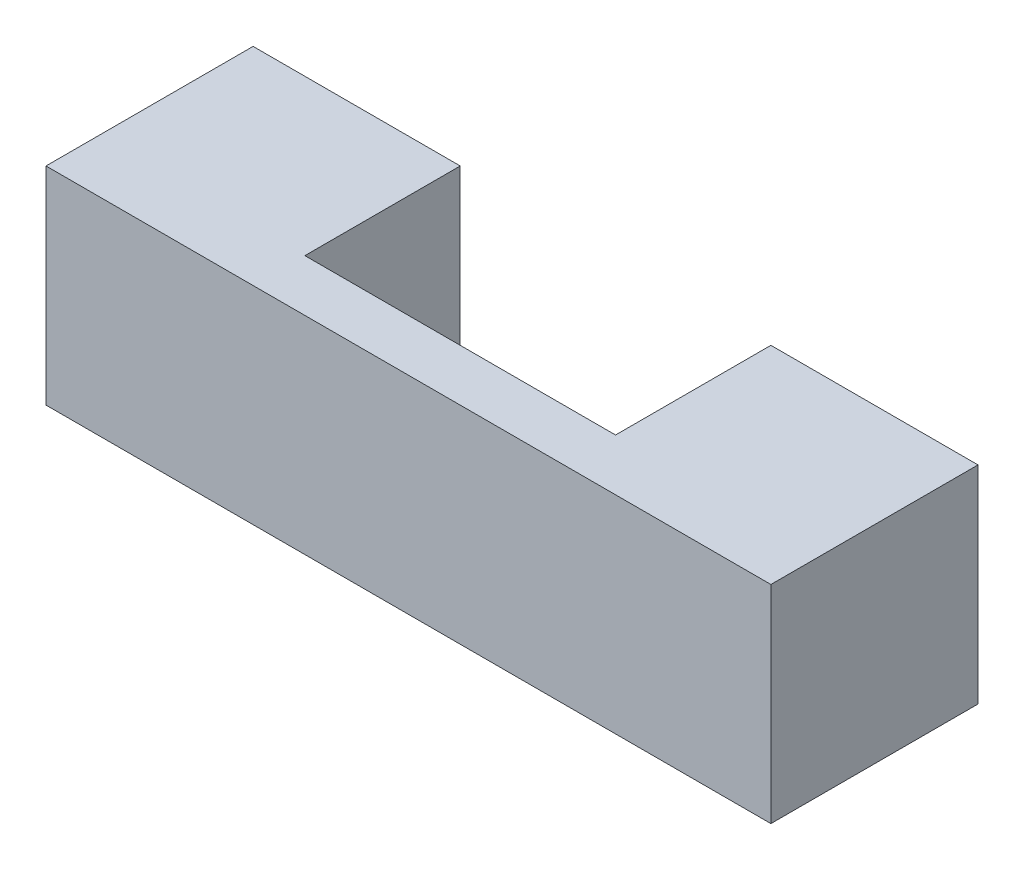
ISO-10303-21;
HEADER;
FILE_DESCRIPTION(('STEP AP214'),'2;1');
FILE_NAME('part.step','',(''),(''),'','','');
FILE_SCHEMA(('AUTOMOTIVE_DESIGN { 1 0 10303 214 1 1 1 1 }'));
ENDSEC;
DATA;
#1=APPLICATION_CONTEXT('core data for automotive mechanical design processes');
#2=APPLICATION_PROTOCOL_DEFINITION('international standard','automotive_design',2000,#1);
#3=PRODUCT_CONTEXT('',#1,'mechanical');
#4=PRODUCT('Part','Part','',(#3));
#5=PRODUCT_RELATED_PRODUCT_CATEGORY('part','',(#4));
#6=PRODUCT_DEFINITION_FORMATION('','',#4);
#7=PRODUCT_DEFINITION_CONTEXT('part definition',#1,'design');
#8=PRODUCT_DEFINITION('design','',#6,#7);
#9=PRODUCT_DEFINITION_SHAPE('','',#8);
#10=(LENGTH_UNIT() NAMED_UNIT(*) SI_UNIT(.MILLI.,.METRE.));
#11=(NAMED_UNIT(*) PLANE_ANGLE_UNIT() SI_UNIT($,.RADIAN.));
#12=(NAMED_UNIT(*) SI_UNIT($,.STERADIAN.) SOLID_ANGLE_UNIT());
#13=UNCERTAINTY_MEASURE_WITH_UNIT(LENGTH_MEASURE(1.E-05),#10,'distance_accuracy_value','');
#14=(GEOMETRIC_REPRESENTATION_CONTEXT(3) GLOBAL_UNCERTAINTY_ASSIGNED_CONTEXT((#13)) GLOBAL_UNIT_ASSIGNED_CONTEXT((#10,
#11,#12)) REPRESENTATION_CONTEXT('',''));
#15=CARTESIAN_POINT('',(0.,0.,0.));
#16=DIRECTION('',(0.,0.,1.));
#17=DIRECTION('',(1.,0.,0.));
#18=AXIS2_PLACEMENT_3D('',#15,#16,#17);
#19=CARTESIAN_POINT('',(0.,4.5,-4.));
#20=DIRECTION('',(0.,0.,-1.));
#21=DIRECTION('',(-1.,0.,0.));
#22=AXIS2_PLACEMENT_3D('',#19,#20,#21);
#23=PLANE('',#22);
#24=DIRECTION('',(-1.,0.,0.));
#25=VECTOR('',#24,1.);
#26=CARTESIAN_POINT('',(0.,4.,-4.));
#27=LINE('',#26,#25);
#28=CARTESIAN_POINT('',(4.5,4.,-4.));
#29=VERTEX_POINT('',#28);
#30=CARTESIAN_POINT('',(0.500000000000001,4.,-4.));
#31=VERTEX_POINT('',#30);
#32=EDGE_CURVE('E105',#29,#31,#27,.T.);
#33=ORIENTED_EDGE('',*,*,#32,.F.);
#34=DIRECTION('',(0.,1.,0.));
#35=VECTOR('',#34,1.);
#36=CARTESIAN_POINT('',(4.5,0.,-4.));
#37=LINE('',#36,#35);
#38=CARTESIAN_POINT('',(4.5,0.,-4.));
#39=VERTEX_POINT('',#38);
#40=EDGE_CURVE('E143',#39,#29,#37,.T.);
#41=ORIENTED_EDGE('',*,*,#40,.F.);
#42=DIRECTION('',(1.,0.,0.));
#43=VECTOR('',#42,1.);
#44=CARTESIAN_POINT('',(0.,0.,-4.));
#45=LINE('',#44,#43);
#46=CARTESIAN_POINT('',(0.5,0.,-4.));
#47=VERTEX_POINT('',#46);
#48=EDGE_CURVE('E159',#47,#39,#45,.T.);
#49=ORIENTED_EDGE('',*,*,#48,.F.);
#50=DIRECTION('',(0.,-1.,0.));
#51=VECTOR('',#50,1.);
#52=CARTESIAN_POINT('',(0.5,0.,-4.));
#53=LINE('',#52,#51);
#54=EDGE_CURVE('E125',#31,#47,#53,.T.);
#55=ORIENTED_EDGE('',*,*,#54,.F.);
#56=EDGE_LOOP('',(#33,#41,#49,#55));
#57=FACE_BOUND('',#56,.T.);
#58=ADVANCED_FACE('F39',(#57),#23,.T.);
#59=CARTESIAN_POINT('',(0.,4.5,0.));
#60=DIRECTION('',(0.,0.,-1.));
#61=DIRECTION('',(-1.,0.,0.));
#62=AXIS2_PLACEMENT_3D('',#59,#60,#61);
#63=PLANE('',#62);
#64=DIRECTION('',(0.,1.,0.));
#65=VECTOR('',#64,1.);
#66=CARTESIAN_POINT('',(14.5,4.5,0.));
#67=LINE('',#66,#65);
#68=CARTESIAN_POINT('',(14.5,0.,0.));
#69=VERTEX_POINT('',#68);
#70=CARTESIAN_POINT('',(14.5,4.,0.));
#71=VERTEX_POINT('',#70);
#72=EDGE_CURVE('E61',#69,#71,#67,.T.);
#73=ORIENTED_EDGE('',*,*,#72,.T.);
#74=DIRECTION('',(1.,0.,0.));
#75=VECTOR('',#74,1.);
#76=CARTESIAN_POINT('',(0.500000000000001,4.,0.));
#77=LINE('',#76,#75);
#78=CARTESIAN_POINT('',(0.500000000000001,4.,0.));
#79=VERTEX_POINT('',#78);
#80=EDGE_CURVE('E55',#79,#71,#77,.T.);
#81=ORIENTED_EDGE('',*,*,#80,.F.);
#82=DIRECTION('',(0.,-1.,0.));
#83=VECTOR('',#82,1.);
#84=CARTESIAN_POINT('',(0.500000000000001,4.5,0.));
#85=LINE('',#84,#83);
#86=CARTESIAN_POINT('',(0.500000000000001,0.,0.));
#87=VERTEX_POINT('',#86);
#88=EDGE_CURVE('E115',#79,#87,#85,.T.);
#89=ORIENTED_EDGE('',*,*,#88,.T.);
#90=DIRECTION('',(1.,0.,0.));
#91=VECTOR('',#90,1.);
#92=CARTESIAN_POINT('',(0.,0.,0.));
#93=LINE('',#92,#91);
#94=EDGE_CURVE('E162',#87,#69,#93,.T.);
#95=ORIENTED_EDGE('',*,*,#94,.T.);
#96=EDGE_LOOP('',(#73,#81,#89,#95));
#97=FACE_BOUND('',#96,.T.);
#98=ADVANCED_FACE('F113',(#97),#63,.F.);
#99=DIRECTION('',(-1.,0.,0.));
#100=VECTOR('',#99,1.);
#101=CARTESIAN_POINT('',(0.,4.,-4.));
#102=LINE('',#101,#100);
#103=CARTESIAN_POINT('',(14.5,4.,-4.));
#104=VERTEX_POINT('',#103);
#105=CARTESIAN_POINT('',(10.5,4.,-4.));
#106=VERTEX_POINT('',#105);
#107=EDGE_CURVE('E176',#104,#106,#102,.T.);
#108=ORIENTED_EDGE('',*,*,#107,.F.);
#109=DIRECTION('',(0.,1.,0.));
#110=VECTOR('',#109,1.);
#111=CARTESIAN_POINT('',(14.5,0.,-4.));
#112=LINE('',#111,#110);
#113=CARTESIAN_POINT('',(14.5,0.,-4.));
#114=VERTEX_POINT('',#113);
#115=EDGE_CURVE('E170',#114,#104,#112,.T.);
#116=ORIENTED_EDGE('',*,*,#115,.F.);
#117=CARTESIAN_POINT('',(10.5,0.,-4.));
#118=VERTEX_POINT('',#117);
#119=EDGE_CURVE('E147',#118,#114,#45,.T.);
#120=ORIENTED_EDGE('',*,*,#119,.F.);
#121=DIRECTION('',(0.,1.,0.));
#122=VECTOR('',#121,1.);
#123=CARTESIAN_POINT('',(10.5,0.,-4.));
#124=LINE('',#123,#122);
#125=EDGE_CURVE('E148',#118,#106,#124,.T.);
#126=ORIENTED_EDGE('',*,*,#125,.T.);
#127=EDGE_LOOP('',(#108,#116,#120,#126));
#128=FACE_BOUND('',#127,.T.);
#129=ADVANCED_FACE('F41',(#128),#23,.T.);
#130=CARTESIAN_POINT('',(0.,0.,0.));
#131=DIRECTION('',(0.,-1.,0.));
#132=DIRECTION('',(0.,0.,-1.));
#133=AXIS2_PLACEMENT_3D('',#130,#131,#132);
#134=PLANE('',#133);
#135=DIRECTION('',(0.,0.,-1.));
#136=VECTOR('',#135,1.);
#137=CARTESIAN_POINT('',(14.5,0.,0.));
#138=LINE('',#137,#136);
#139=EDGE_CURVE('E48',#69,#114,#138,.T.);
#140=ORIENTED_EDGE('',*,*,#139,.F.);
#141=ORIENTED_EDGE('',*,*,#94,.F.);
#142=DIRECTION('',(0.,0.,1.));
#143=VECTOR('',#142,1.);
#144=CARTESIAN_POINT('',(0.500000000000001,0.,0.));
#145=LINE('',#144,#143);
#146=EDGE_CURVE('E121',#47,#87,#145,.T.);
#147=ORIENTED_EDGE('',*,*,#146,.F.);
#148=ORIENTED_EDGE('',*,*,#48,.T.);
#149=DIRECTION('',(0.,0.,1.));
#150=VECTOR('',#149,1.);
#151=CARTESIAN_POINT('',(4.5,0.,-4.));
#152=LINE('',#151,#150);
#153=CARTESIAN_POINT('',(4.5,0.,-1.));
#154=VERTEX_POINT('',#153);
#155=EDGE_CURVE('E124',#39,#154,#152,.T.);
#156=ORIENTED_EDGE('',*,*,#155,.T.);
#157=DIRECTION('',(1.,0.,0.));
#158=VECTOR('',#157,1.);
#159=CARTESIAN_POINT('',(4.5,0.,-1.));
#160=LINE('',#159,#158);
#161=CARTESIAN_POINT('',(10.5,0.,-1.));
#162=VERTEX_POINT('',#161);
#163=EDGE_CURVE('E130',#154,#162,#160,.T.);
#164=ORIENTED_EDGE('',*,*,#163,.T.);
#165=DIRECTION('',(0.,0.,-1.));
#166=VECTOR('',#165,1.);
#167=CARTESIAN_POINT('',(10.5,0.,-4.));
#168=LINE('',#167,#166);
#169=EDGE_CURVE('E138',#162,#118,#168,.T.);
#170=ORIENTED_EDGE('',*,*,#169,.T.);
#171=ORIENTED_EDGE('',*,*,#119,.T.);
#172=EDGE_LOOP('',(#140,#141,#147,#148,#156,#164,#170,#171));
#173=FACE_BOUND('',#172,.T.);
#174=ADVANCED_FACE('F179',(#173),#134,.T.);
#175=CARTESIAN_POINT('',(4.5,0.,-4.));
#176=DIRECTION('',(-1.,0.,0.));
#177=DIRECTION('',(0.,0.,1.));
#178=AXIS2_PLACEMENT_3D('',#175,#176,#177);
#179=PLANE('',#178);
#180=ORIENTED_EDGE('',*,*,#40,.T.);
#181=DIRECTION('',(0.,0.,1.));
#182=VECTOR('',#181,1.);
#183=CARTESIAN_POINT('',(4.5,4.,-4.));
#184=LINE('',#183,#182);
#185=CARTESIAN_POINT('',(4.5,4.,-1.));
#186=VERTEX_POINT('',#185);
#187=EDGE_CURVE('E194',#29,#186,#184,.T.);
#188=ORIENTED_EDGE('',*,*,#187,.T.);
#189=DIRECTION('',(0.,1.,0.));
#190=VECTOR('',#189,1.);
#191=CARTESIAN_POINT('',(4.5,0.,-1.));
#192=LINE('',#191,#190);
#193=EDGE_CURVE('E142',#154,#186,#192,.T.);
#194=ORIENTED_EDGE('',*,*,#193,.F.);
#195=ORIENTED_EDGE('',*,*,#155,.F.);
#196=EDGE_LOOP('',(#180,#188,#194,#195));
#197=FACE_BOUND('',#196,.T.);
#198=ADVANCED_FACE('F204',(#197),#179,.F.);
#199=CARTESIAN_POINT('',(10.5,0.,-4.));
#200=DIRECTION('',(1.,0.,0.));
#201=DIRECTION('',(0.,0.,-1.));
#202=AXIS2_PLACEMENT_3D('',#199,#200,#201);
#203=PLANE('',#202);
#204=DIRECTION('',(0.,1.,0.));
#205=VECTOR('',#204,1.);
#206=CARTESIAN_POINT('',(10.5,0.,-1.));
#207=LINE('',#206,#205);
#208=CARTESIAN_POINT('',(10.5,4.,-1.));
#209=VERTEX_POINT('',#208);
#210=EDGE_CURVE('E152',#162,#209,#207,.T.);
#211=ORIENTED_EDGE('',*,*,#210,.T.);
#212=DIRECTION('',(0.,0.,-1.));
#213=VECTOR('',#212,1.);
#214=CARTESIAN_POINT('',(10.5,4.,-4.));
#215=LINE('',#214,#213);
#216=EDGE_CURVE('E191',#209,#106,#215,.T.);
#217=ORIENTED_EDGE('',*,*,#216,.T.);
#218=ORIENTED_EDGE('',*,*,#125,.F.);
#219=ORIENTED_EDGE('',*,*,#169,.F.);
#220=EDGE_LOOP('',(#211,#217,#218,#219));
#221=FACE_BOUND('',#220,.T.);
#222=ADVANCED_FACE('F184',(#221),#203,.F.);
#223=CARTESIAN_POINT('',(4.5,0.,-1.));
#224=DIRECTION('',(0.,0.,1.));
#225=DIRECTION('',(1.,0.,0.));
#226=AXIS2_PLACEMENT_3D('',#223,#224,#225);
#227=PLANE('',#226);
#228=ORIENTED_EDGE('',*,*,#193,.T.);
#229=DIRECTION('',(1.,0.,0.));
#230=VECTOR('',#229,1.);
#231=CARTESIAN_POINT('',(4.5,4.,-1.));
#232=LINE('',#231,#230);
#233=EDGE_CURVE('E110',#186,#209,#232,.T.);
#234=ORIENTED_EDGE('',*,*,#233,.T.);
#235=ORIENTED_EDGE('',*,*,#210,.F.);
#236=ORIENTED_EDGE('',*,*,#163,.F.);
#237=EDGE_LOOP('',(#228,#234,#235,#236));
#238=FACE_BOUND('',#237,.T.);
#239=ADVANCED_FACE('F188',(#238),#227,.F.);
#240=CARTESIAN_POINT('',(0.500000000000001,0.,5.5));
#241=DIRECTION('',(1.,0.,0.));
#242=DIRECTION('',(0.,0.,-1.));
#243=AXIS2_PLACEMENT_3D('',#240,#241,#242);
#244=PLANE('',#243);
#245=ORIENTED_EDGE('',*,*,#88,.F.);
#246=DIRECTION('',(0.,0.,1.));
#247=VECTOR('',#246,1.);
#248=CARTESIAN_POINT('',(0.500000000000001,4.,-9.5));
#249=LINE('',#248,#247);
#250=EDGE_CURVE('E102',#31,#79,#249,.T.);
#251=ORIENTED_EDGE('',*,*,#250,.F.);
#252=ORIENTED_EDGE('',*,*,#54,.T.);
#253=ORIENTED_EDGE('',*,*,#146,.T.);
#254=EDGE_LOOP('',(#245,#251,#252,#253));
#255=FACE_BOUND('',#254,.T.);
#256=ADVANCED_FACE('F119',(#255),#244,.F.);
#257=CARTESIAN_POINT('',(14.5,0.,5.5));
#258=DIRECTION('',(-1.,0.,0.));
#259=DIRECTION('',(0.,0.,1.));
#260=AXIS2_PLACEMENT_3D('',#257,#258,#259);
#261=PLANE('',#260);
#262=ORIENTED_EDGE('',*,*,#115,.T.);
#263=DIRECTION('',(0.,0.,1.));
#264=VECTOR('',#263,1.);
#265=CARTESIAN_POINT('',(14.5,4.,5.5));
#266=LINE('',#265,#264);
#267=EDGE_CURVE('E11',#104,#71,#266,.T.);
#268=ORIENTED_EDGE('',*,*,#267,.T.);
#269=ORIENTED_EDGE('',*,*,#72,.F.);
#270=ORIENTED_EDGE('',*,*,#139,.T.);
#271=EDGE_LOOP('',(#262,#268,#269,#270));
#272=FACE_BOUND('',#271,.T.);
#273=ADVANCED_FACE('F169',(#272),#261,.F.);
#274=CARTESIAN_POINT('',(0.500000000000001,4.,-9.5));
#275=DIRECTION('',(0.,-1.,0.));
#276=DIRECTION('',(0.,0.,-1.));
#277=AXIS2_PLACEMENT_3D('',#274,#275,#276);
#278=PLANE('',#277);
#279=ORIENTED_EDGE('',*,*,#32,.T.);
#280=ORIENTED_EDGE('',*,*,#250,.T.);
#281=ORIENTED_EDGE('',*,*,#80,.T.);
#282=ORIENTED_EDGE('',*,*,#267,.F.);
#283=ORIENTED_EDGE('',*,*,#107,.T.);
#284=ORIENTED_EDGE('',*,*,#216,.F.);
#285=ORIENTED_EDGE('',*,*,#233,.F.);
#286=ORIENTED_EDGE('',*,*,#187,.F.);
#287=EDGE_LOOP('',(#279,#280,#281,#282,#283,#284,#285,#286));
#288=FACE_BOUND('',#287,.T.);
#289=ADVANCED_FACE('F103',(#288),#278,.F.);
#290=CLOSED_SHELL('',(#58,#98,#129,#174,#198,#222,#239,#256,#273,#289));
#291=MANIFOLD_SOLID_BREP('B2',#290);
#292=ADVANCED_BREP_SHAPE_REPRESENTATION('',(#18,#291),#14);
#293=SHAPE_DEFINITION_REPRESENTATION(#9,#292);
ENDSEC;
END-ISO-10303-21;
